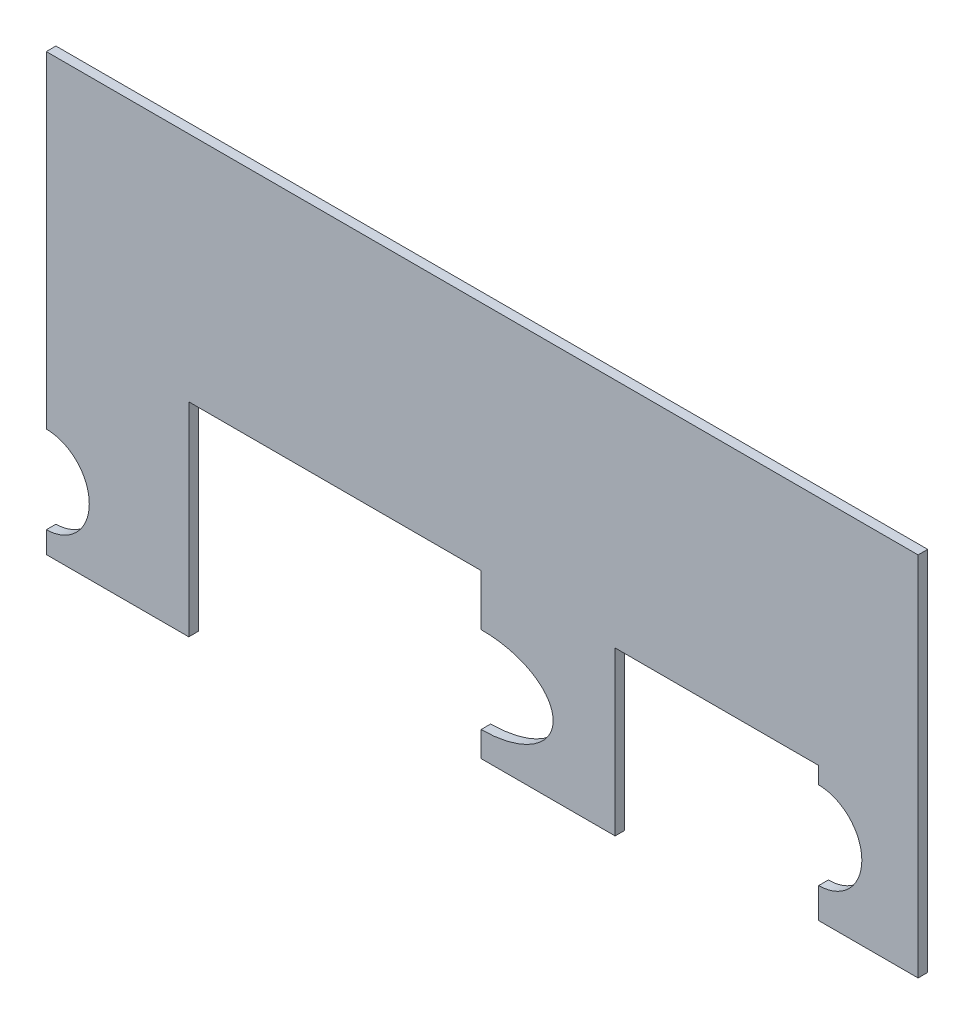
ISO-10303-21;
HEADER;
FILE_DESCRIPTION(('STEP AP214'),'2;1');
FILE_NAME('part.step','',(''),(''),'','','');
FILE_SCHEMA(('AUTOMOTIVE_DESIGN { 1 0 10303 214 1 1 1 1 }'));
ENDSEC;
DATA;
#1=APPLICATION_CONTEXT('core data for automotive mechanical design processes');
#2=APPLICATION_PROTOCOL_DEFINITION('international standard','automotive_design',2000,#1);
#3=PRODUCT_CONTEXT('',#1,'mechanical');
#4=PRODUCT('Part','Part','',(#3));
#5=PRODUCT_RELATED_PRODUCT_CATEGORY('part','',(#4));
#6=PRODUCT_DEFINITION_FORMATION('','',#4);
#7=PRODUCT_DEFINITION_CONTEXT('part definition',#1,'design');
#8=PRODUCT_DEFINITION('design','',#6,#7);
#9=PRODUCT_DEFINITION_SHAPE('','',#8);
#10=(LENGTH_UNIT() NAMED_UNIT(*) SI_UNIT(.MILLI.,.METRE.));
#11=(NAMED_UNIT(*) PLANE_ANGLE_UNIT() SI_UNIT($,.RADIAN.));
#12=(NAMED_UNIT(*) SI_UNIT($,.STERADIAN.) SOLID_ANGLE_UNIT());
#13=UNCERTAINTY_MEASURE_WITH_UNIT(LENGTH_MEASURE(1.E-05),#10,'distance_accuracy_value','');
#14=(GEOMETRIC_REPRESENTATION_CONTEXT(3) GLOBAL_UNCERTAINTY_ASSIGNED_CONTEXT((#13)) GLOBAL_UNIT_ASSIGNED_CONTEXT((#10,
#11,#12)) REPRESENTATION_CONTEXT('',''));
#15=CARTESIAN_POINT('',(0.,0.,0.));
#16=DIRECTION('',(0.,0.,1.));
#17=DIRECTION('',(1.,0.,0.));
#18=AXIS2_PLACEMENT_3D('',#15,#16,#17);
#19=CARTESIAN_POINT('',(0.,0.,3.));
#20=DIRECTION('',(0.,0.,-1.));
#21=DIRECTION('',(-1.,0.,0.));
#22=AXIS2_PLACEMENT_3D('',#19,#20,#21);
#23=PLANE('',#22);
#24=DIRECTION('',(0.,1.,0.));
#25=VECTOR('',#24,1.);
#26=CARTESIAN_POINT('',(-271.955362236481,0.,3.));
#27=LINE('',#26,#25);
#28=CARTESIAN_POINT('',(-271.955362236477,-355.976421691856,3.));
#29=VERTEX_POINT('',#28);
#30=CARTESIAN_POINT('',(-271.955362236481,-254.,3.));
#31=VERTEX_POINT('',#30);
#32=EDGE_CURVE('E188',#29,#31,#27,.T.);
#33=ORIENTED_EDGE('',*,*,#32,.F.);
#34=CARTESIAN_POINT('',(-278.621518651951,-381.538192290105,3.));
#35=CARTESIAN_POINT('',(-278.370340025433,-381.675788485271,3.));
#36=CARTESIAN_POINT('',(-277.859461828968,-381.935426093259,3.));
#37=CARTESIAN_POINT('',(-276.719402462415,-382.422402226099,3.));
#38=CARTESIAN_POINT('',(-274.453837445501,-383.121197535497,3.));
#39=CARTESIAN_POINT('',(-270.353871795164,-383.430649394641,3.));
#40=CARTESIAN_POINT('',(-265.517981505841,-381.766237096782,3.));
#41=CARTESIAN_POINT('',(-262.1227072671,-378.912933368147,3.));
#42=CARTESIAN_POINT('',(-260.11186544475,-376.132298445354,3.));
#43=CARTESIAN_POINT('',(-258.851133292206,-372.940751822178,3.));
#44=CARTESIAN_POINT('',(-258.274482706022,-368.543399957071,3.));
#45=CARTESIAN_POINT('',(-259.475297643461,-363.572067472349,3.));
#46=CARTESIAN_POINT('',(-261.943328374558,-360.283556700368,3.));
#47=CARTESIAN_POINT('',(-263.751900196114,-358.750531033077,3.));
#48=CARTESIAN_POINT('',(-264.776043252502,-358.051952395218,3.));
#49=CARTESIAN_POINT('',(-265.516797716913,-357.615831636206,3.));
#50=CARTESIAN_POINT('',(-266.28311501161,-357.226375224223,3.));
#51=CARTESIAN_POINT('',(-267.423174378163,-356.739399091383,3.));
#52=CARTESIAN_POINT('',(-269.688739395077,-356.040603781985,3.));
#53=CARTESIAN_POINT('',(-273.788705045415,-355.731151922841,3.));
#54=CARTESIAN_POINT('',(-278.624595334737,-357.3955642207,3.));
#55=CARTESIAN_POINT('',(-282.019869573478,-360.248867949335,3.));
#56=CARTESIAN_POINT('',(-284.030711395829,-363.029502872128,3.));
#57=CARTESIAN_POINT('',(-285.291443548372,-366.221049495305,3.));
#58=CARTESIAN_POINT('',(-285.868094134556,-370.618401360411,3.));
#59=CARTESIAN_POINT('',(-284.667279197117,-375.589733845133,3.));
#60=CARTESIAN_POINT('',(-282.19924846602,-378.878244617114,3.));
#61=CARTESIAN_POINT('',(-280.390676644465,-380.411270284406,3.));
#62=CARTESIAN_POINT('',(-279.366533588076,-381.109848922264,3.));
#63=CARTESIAN_POINT('',(-278.872697278469,-381.400596094939,3.));
#64=CARTESIAN_POINT('',(-278.621518651951,-381.538192290105,3.));
#65=B_SPLINE_CURVE_WITH_KNOTS('',3,(#34,#35,#36,#37,#38,#39,#40,#41,#42,#43,#44,#45,#46,#47,#48,
#49,#50,#51,#52,#53,#54,#55,#56,#57,#58,#59,#60,#61,#62,#63,#64),.UNSPECIFIED.,.T.,.F.,(4,1,1,1,
1,1,1,1,1,1,1,1,1,1,1,1,1,1,1,1,1,1,1,1,1,1,1,1,4),(0.,0.015625,0.03125,0.0625,0.125,0.1875,
0.21875,0.25,0.28125,0.3125,0.375,0.4375,0.46875,0.484375,0.5,0.515625,0.53125,0.5625,0.625,
0.6875,0.71875,0.75,0.78125,0.8125,0.875,0.9375,0.96875,0.984375,1.),.UNSPECIFIED.);
#66=CARTESIAN_POINT('',(-271.955362243084,-383.183342538427,3.));
#67=VERTEX_POINT('',#66);
#68=EDGE_CURVE('E193',#67,#29,#65,.T.);
#69=ORIENTED_EDGE('',*,*,#68,.F.);
#70=CARTESIAN_POINT('',(-271.955362236481,-389.89,3.));
#71=VERTEX_POINT('',#70);
#72=EDGE_CURVE('E179',#71,#67,#27,.T.);
#73=ORIENTED_EDGE('',*,*,#72,.F.);
#74=DIRECTION('',(-1.,0.,0.));
#75=VECTOR('',#74,1.);
#76=CARTESIAN_POINT('',(0.,-389.89,3.));
#77=LINE('',#76,#75);
#78=CARTESIAN_POINT('',(-227.505362236481,-389.89,3.));
#79=VERTEX_POINT('',#78);
#80=EDGE_CURVE('E167',#79,#71,#77,.T.);
#81=ORIENTED_EDGE('',*,*,#80,.F.);
#82=DIRECTION('',(0.,-1.,0.));
#83=VECTOR('',#82,1.);
#84=CARTESIAN_POINT('',(-227.505362236481,0.,3.));
#85=LINE('',#84,#83);
#86=CARTESIAN_POINT('',(-227.505362236481,-326.39,3.));
#87=VERTEX_POINT('',#86);
#88=EDGE_CURVE('E178',#87,#79,#85,.T.);
#89=ORIENTED_EDGE('',*,*,#88,.F.);
#90=DIRECTION('',(-1.,0.,0.));
#91=VECTOR('',#90,1.);
#92=CARTESIAN_POINT('',(0.,-326.39,3.));
#93=LINE('',#92,#91);
#94=CARTESIAN_POINT('',(-136.330752090625,-326.39,3.));
#95=VERTEX_POINT('',#94);
#96=EDGE_CURVE('E394',#95,#87,#93,.T.);
#97=ORIENTED_EDGE('',*,*,#96,.F.);
#98=DIRECTION('',(0.,1.,0.));
#99=VECTOR('',#98,1.);
#100=CARTESIAN_POINT('',(-136.330752090625,0.,3.));
#101=LINE('',#100,#99);
#102=CARTESIAN_POINT('',(-136.330752071237,-342.354877874696,3.));
#103=VERTEX_POINT('',#102);
#104=EDGE_CURVE('E397',#103,#95,#101,.T.);
#105=ORIENTED_EDGE('',*,*,#104,.F.);
#106=CARTESIAN_POINT('',(-158.330065966523,-356.075599307462,3.));
#107=CARTESIAN_POINT('',(-158.327001416,-356.373395785938,3.));
#108=CARTESIAN_POINT('',(-158.290080956929,-356.968671876576,3.));
#109=CARTESIAN_POINT('',(-158.067598917984,-358.24660886727,3.));
#110=CARTESIAN_POINT('',(-157.224453748445,-360.632921919859,3.));
#111=CARTESIAN_POINT('',(-154.882508757872,-363.615638807092,3.));
#112=CARTESIAN_POINT('',(-150.614101821919,-366.327010398472,3.));
#113=CARTESIAN_POINT('',(-146.438166973224,-368.010630748896,3.));
#114=CARTESIAN_POINT('',(-141.43480585188,-369.121724295185,3.));
#115=CARTESIAN_POINT('',(-135.953318407634,-369.477027412417,3.));
#116=CARTESIAN_POINT('',(-130.480303715626,-369.008994200355,3.));
#117=CARTESIAN_POINT('',(-125.500867751197,-367.795170137595,3.));
#118=CARTESIAN_POINT('',(-121.360465047816,-366.025968397051,3.));
#119=CARTESIAN_POINT('',(-117.148760272717,-363.227330055849,3.));
#120=CARTESIAN_POINT('',(-114.868693567404,-360.197049179828,3.));
#121=CARTESIAN_POINT('',(-114.074835680623,-357.793890130272,3.));
#122=CARTESIAN_POINT('',(-113.878699845457,-356.511645245703,3.));
#123=CARTESIAN_POINT('',(-113.841706459993,-355.617780510805,3.));
#124=CARTESIAN_POINT('',(-113.897087148599,-354.724866374849,3.));
#125=CARTESIAN_POINT('',(-114.119569187544,-353.446929384154,3.));
#126=CARTESIAN_POINT('',(-114.962714357083,-351.060616331566,3.));
#127=CARTESIAN_POINT('',(-117.304659347656,-348.077899444333,3.));
#128=CARTESIAN_POINT('',(-121.57306628361,-345.366527852953,3.));
#129=CARTESIAN_POINT('',(-125.749001132304,-343.682907502528,3.));
#130=CARTESIAN_POINT('',(-130.752362253648,-342.57181395624,3.));
#131=CARTESIAN_POINT('',(-136.233849697894,-342.216510839008,3.));
#132=CARTESIAN_POINT('',(-141.706864389903,-342.68454405107,3.));
#133=CARTESIAN_POINT('',(-146.686300354332,-343.89836811383,3.));
#134=CARTESIAN_POINT('',(-150.826703057712,-345.667569854374,3.));
#135=CARTESIAN_POINT('',(-155.038407832811,-348.466208195576,3.));
#136=CARTESIAN_POINT('',(-157.318474538124,-351.496489071597,3.));
#137=CARTESIAN_POINT('',(-158.112332424906,-353.899648121153,3.));
#138=CARTESIAN_POINT('',(-158.308468260072,-355.181893005722,3.));
#139=CARTESIAN_POINT('',(-158.333130517047,-355.777802828987,3.));
#140=CARTESIAN_POINT('',(-158.330065966523,-356.075599307462,3.));
#141=B_SPLINE_CURVE_WITH_KNOTS('',3,(#106,#107,#108,#109,#110,#111,#112,#113,#114,#115,#116,
#117,#118,#119,#120,#121,#122,#123,#124,#125,#126,#127,#128,#129,#130,#131,#132,#133,#134,#135,
#136,#137,#138,#139,#140),.UNSPECIFIED.,.T.,.F.,(4,1,1,1,1,1,1,1,1,1,1,1,1,1,1,1,1,1,1,1,1,1,1,
1,1,1,1,1,1,1,1,1,4),(0.,0.015625,0.03125,0.0625,0.125,0.15625,0.1875,0.21875,0.25,0.28125,
0.3125,0.34375,0.375,0.4375,0.46875,0.484375,0.5,0.515625,0.53125,0.5625,0.625,0.65625,0.6875,
0.71875,0.75,0.78125,0.8125,0.84375,0.875,0.9375,0.96875,0.984375,1.),.UNSPECIFIED.);
#142=CARTESIAN_POINT('',(-136.330752071393,-369.341737674634,3.));
#143=VERTEX_POINT('',#142);
#144=EDGE_CURVE('E330',#143,#103,#141,.T.);
#145=ORIENTED_EDGE('',*,*,#144,.F.);
#146=CARTESIAN_POINT('',(-136.330752090625,-377.19,3.));
#147=VERTEX_POINT('',#146);
#148=EDGE_CURVE('E63',#147,#143,#101,.T.);
#149=ORIENTED_EDGE('',*,*,#148,.F.);
#150=DIRECTION('',(-1.,0.,0.));
#151=VECTOR('',#150,1.);
#152=CARTESIAN_POINT('',(0.,-377.19,3.));
#153=LINE('',#152,#151);
#154=CARTESIAN_POINT('',(-94.5125920507911,-377.19,3.));
#155=VERTEX_POINT('',#154);
#156=EDGE_CURVE('E402',#155,#147,#153,.T.);
#157=ORIENTED_EDGE('',*,*,#156,.F.);
#158=DIRECTION('',(0.,-1.,0.));
#159=VECTOR('',#158,1.);
#160=CARTESIAN_POINT('',(-94.512592050791,0.,3.));
#161=LINE('',#160,#159);
#162=CARTESIAN_POINT('',(-94.5125920507911,-326.39,3.));
#163=VERTEX_POINT('',#162);
#164=EDGE_CURVE('E405',#163,#155,#161,.T.);
#165=ORIENTED_EDGE('',*,*,#164,.F.);
#166=DIRECTION('',(-1.,0.,0.));
#167=VECTOR('',#166,1.);
#168=CARTESIAN_POINT('',(0.,-326.39,3.));
#169=LINE('',#168,#167);
#170=CARTESIAN_POINT('',(-31.0125920507911,-326.39,3.));
#171=VERTEX_POINT('',#170);
#172=EDGE_CURVE('E407',#171,#163,#169,.T.);
#173=ORIENTED_EDGE('',*,*,#172,.F.);
#174=DIRECTION('',(0.,1.,0.));
#175=VECTOR('',#174,1.);
#176=CARTESIAN_POINT('',(-31.0125920507911,0.,3.));
#177=LINE('',#176,#175);
#178=CARTESIAN_POINT('',(-31.0125920507874,-331.651825693571,3.));
#179=VERTEX_POINT('',#178);
#180=EDGE_CURVE('E210',#179,#171,#177,.T.);
#181=ORIENTED_EDGE('',*,*,#180,.F.);
#182=CARTESIAN_POINT('',(-33.9641655474843,-331.962198831726,3.));
#183=CARTESIAN_POINT('',(-34.2438680765539,-332.023492326205,3.));
#184=CARTESIAN_POINT('',(-34.7994902438659,-332.163341899727,3.));
#185=CARTESIAN_POINT('',(-35.978750804576,-332.544818645064,3.));
#186=CARTESIAN_POINT('',(-38.1457535776064,-333.504844288757,3.));
#187=CARTESIAN_POINT('',(-41.4407723492287,-335.959441017826,3.));
#188=CARTESIAN_POINT('',(-43.9959626879415,-340.379536121152,3.));
#189=CARTESIAN_POINT('',(-44.6840393480456,-344.749082337409,3.));
#190=CARTESIAN_POINT('',(-44.3752989422524,-348.156558860998,3.));
#191=CARTESIAN_POINT('',(-43.2307594991895,-351.380879930658,3.));
#192=CARTESIAN_POINT('',(-40.7784217971011,-355.062241556619,3.));
#193=CARTESIAN_POINT('',(-36.6089376847144,-358.008703948379,3.));
#194=CARTESIAN_POINT('',(-32.5893842807403,-358.860398870459,3.));
#195=CARTESIAN_POINT('',(-30.2194935811096,-358.826218076529,3.));
#196=CARTESIAN_POINT('',(-28.9887718381782,-358.679575760822,3.));
#197=CARTESIAN_POINT('',(-28.1439899147287,-358.521589154227,3.));
#198=CARTESIAN_POINT('',(-27.3105566637607,-358.311814793945,3.));
#199=CARTESIAN_POINT('',(-26.1312961030506,-357.930338048607,3.));
#200=CARTESIAN_POINT('',(-23.9642933300201,-356.970312404914,3.));
#201=CARTESIAN_POINT('',(-20.6692745583979,-354.515715675846,3.));
#202=CARTESIAN_POINT('',(-18.1140842196851,-350.09562057252,3.));
#203=CARTESIAN_POINT('',(-17.426007559581,-345.726074356263,3.));
#204=CARTESIAN_POINT('',(-17.7347479653742,-342.318597832674,3.));
#205=CARTESIAN_POINT('',(-18.8792874084371,-339.094276763014,3.));
#206=CARTESIAN_POINT('',(-21.3316251105255,-335.412915137052,3.));
#207=CARTESIAN_POINT('',(-25.5011092229122,-332.466452745293,3.));
#208=CARTESIAN_POINT('',(-29.5206626268863,-331.614757823212,3.));
#209=CARTESIAN_POINT('',(-31.890553326517,-331.648938617143,3.));
#210=CARTESIAN_POINT('',(-33.1212750694484,-331.79558093285,3.));
#211=CARTESIAN_POINT('',(-33.6844630184148,-331.900905337246,3.));
#212=CARTESIAN_POINT('',(-33.9641655474843,-331.962198831726,3.));
#213=B_SPLINE_CURVE_WITH_KNOTS('',3,(#182,#183,#184,#185,#186,#187,#188,#189,#190,#191,#192,
#193,#194,#195,#196,#197,#198,#199,#200,#201,#202,#203,#204,#205,#206,#207,#208,#209,#210,#211,
#212),.UNSPECIFIED.,.T.,.F.,(4,1,1,1,1,1,1,1,1,1,1,1,1,1,1,1,1,1,1,1,1,1,1,1,1,1,1,1,4),(0.,
0.015625,0.03125,0.0625,0.125,0.1875,0.21875,0.25,0.28125,0.3125,0.375,0.4375,0.46875,0.484375,
0.5,0.515625,0.53125,0.5625,0.625,0.6875,0.71875,0.75,0.78125,0.8125,0.875,0.9375,0.96875,
0.984375,1.),.UNSPECIFIED.);
#214=CARTESIAN_POINT('',(-31.0125920386938,-358.823600104807,3.));
#215=VERTEX_POINT('',#214);
#216=EDGE_CURVE('E345',#215,#179,#213,.T.);
#217=ORIENTED_EDGE('',*,*,#216,.F.);
#218=CARTESIAN_POINT('',(-31.0125920507911,-368.3,3.));
#219=VERTEX_POINT('',#218);
#220=EDGE_CURVE('E55',#219,#215,#177,.T.);
#221=ORIENTED_EDGE('',*,*,#220,.F.);
#222=DIRECTION('',(-1.,0.,0.));
#223=VECTOR('',#222,1.);
#224=CARTESIAN_POINT('',(0.,-368.3,3.));
#225=LINE('',#224,#223);
#226=CARTESIAN_POINT('',(0.,-368.3,3.));
#227=VERTEX_POINT('',#226);
#228=EDGE_CURVE('E202',#227,#219,#225,.T.);
#229=ORIENTED_EDGE('',*,*,#228,.F.);
#230=DIRECTION('',(0.,1.,0.));
#231=VECTOR('',#230,1.);
#232=CARTESIAN_POINT('',(3.88578058618805E-13,-254.,3.));
#233=LINE('',#232,#231);
#234=CARTESIAN_POINT('',(3.88578058618805E-13,-254.,3.));
#235=VERTEX_POINT('',#234);
#236=EDGE_CURVE('E364',#227,#235,#233,.T.);
#237=ORIENTED_EDGE('',*,*,#236,.T.);
#238=DIRECTION('',(-1.,0.,0.));
#239=VECTOR('',#238,1.);
#240=CARTESIAN_POINT('',(-330.2,-254.,3.));
#241=LINE('',#240,#239);
#242=EDGE_CURVE('E48',#235,#31,#241,.T.);
#243=ORIENTED_EDGE('',*,*,#242,.T.);
#244=EDGE_LOOP('',(#33,#69,#73,#81,#89,#97,#105,#145,#149,#157,#165,#173,#181,#217,#221,#229,
#237,#243));
#245=FACE_BOUND('',#244,.T.);
#246=ADVANCED_FACE('F39',(#245),#23,.F.);
#247=CARTESIAN_POINT('',(0.,0.,0.));
#248=DIRECTION('',(0.,0.,-1.));
#249=DIRECTION('',(-1.,0.,0.));
#250=AXIS2_PLACEMENT_3D('',#247,#248,#249);
#251=PLANE('',#250);
#252=CARTESIAN_POINT('',(-278.621518651951,-381.538192290105,0.));
#253=CARTESIAN_POINT('',(-278.370340025433,-381.675788485271,0.));
#254=CARTESIAN_POINT('',(-277.859461828968,-381.935426093259,0.));
#255=CARTESIAN_POINT('',(-276.719402462415,-382.422402226099,0.));
#256=CARTESIAN_POINT('',(-274.453837445501,-383.121197535497,0.));
#257=CARTESIAN_POINT('',(-270.353871795164,-383.430649394641,0.));
#258=CARTESIAN_POINT('',(-265.517981505841,-381.766237096782,0.));
#259=CARTESIAN_POINT('',(-262.1227072671,-378.912933368147,0.));
#260=CARTESIAN_POINT('',(-260.11186544475,-376.132298445354,0.));
#261=CARTESIAN_POINT('',(-258.851133292206,-372.940751822178,0.));
#262=CARTESIAN_POINT('',(-258.274482706022,-368.543399957071,0.));
#263=CARTESIAN_POINT('',(-259.475297643461,-363.572067472349,0.));
#264=CARTESIAN_POINT('',(-261.943328374558,-360.283556700368,0.));
#265=CARTESIAN_POINT('',(-263.751900196114,-358.750531033077,0.));
#266=CARTESIAN_POINT('',(-264.776043252502,-358.051952395218,0.));
#267=CARTESIAN_POINT('',(-265.516797716913,-357.615831636206,0.));
#268=CARTESIAN_POINT('',(-266.28311501161,-357.226375224223,0.));
#269=CARTESIAN_POINT('',(-267.423174378163,-356.739399091383,0.));
#270=CARTESIAN_POINT('',(-269.688739395077,-356.040603781985,0.));
#271=CARTESIAN_POINT('',(-273.788705045415,-355.731151922841,0.));
#272=CARTESIAN_POINT('',(-278.624595334737,-357.3955642207,0.));
#273=CARTESIAN_POINT('',(-282.019869573478,-360.248867949335,0.));
#274=CARTESIAN_POINT('',(-284.030711395829,-363.029502872128,0.));
#275=CARTESIAN_POINT('',(-285.291443548372,-366.221049495305,0.));
#276=CARTESIAN_POINT('',(-285.868094134556,-370.618401360411,0.));
#277=CARTESIAN_POINT('',(-284.667279197117,-375.589733845133,0.));
#278=CARTESIAN_POINT('',(-282.19924846602,-378.878244617114,0.));
#279=CARTESIAN_POINT('',(-280.390676644465,-380.411270284406,0.));
#280=CARTESIAN_POINT('',(-279.366533588076,-381.109848922264,0.));
#281=CARTESIAN_POINT('',(-278.872697278469,-381.400596094939,0.));
#282=CARTESIAN_POINT('',(-278.621518651951,-381.538192290105,0.));
#283=B_SPLINE_CURVE_WITH_KNOTS('',3,(#252,#253,#254,#255,#256,#257,#258,#259,#260,#261,#262,
#263,#264,#265,#266,#267,#268,#269,#270,#271,#272,#273,#274,#275,#276,#277,#278,#279,#280,#281,
#282),.UNSPECIFIED.,.T.,.F.,(4,1,1,1,1,1,1,1,1,1,1,1,1,1,1,1,1,1,1,1,1,1,1,1,1,1,1,1,4),(0.,
0.015625,0.03125,0.0625,0.125,0.1875,0.21875,0.25,0.28125,0.3125,0.375,0.4375,0.46875,0.484375,
0.5,0.515625,0.53125,0.5625,0.625,0.6875,0.71875,0.75,0.78125,0.8125,0.875,0.9375,0.96875,
0.984375,1.),.UNSPECIFIED.);
#284=CARTESIAN_POINT('',(-271.955362243084,-383.183342538427,0.));
#285=VERTEX_POINT('',#284);
#286=CARTESIAN_POINT('',(-271.955362236477,-355.976421691856,0.));
#287=VERTEX_POINT('',#286);
#288=EDGE_CURVE('E254',#285,#287,#283,.T.);
#289=ORIENTED_EDGE('',*,*,#288,.T.);
#290=DIRECTION('',(0.,1.,0.));
#291=VECTOR('',#290,1.);
#292=CARTESIAN_POINT('',(-271.955362236481,0.,0.));
#293=LINE('',#292,#291);
#294=CARTESIAN_POINT('',(-271.955362236481,-254.,0.));
#295=VERTEX_POINT('',#294);
#296=EDGE_CURVE('E195',#287,#295,#293,.T.);
#297=ORIENTED_EDGE('',*,*,#296,.T.);
#298=DIRECTION('',(-1.,0.,0.));
#299=VECTOR('',#298,1.);
#300=CARTESIAN_POINT('',(-330.2,-254.,0.));
#301=LINE('',#300,#299);
#302=CARTESIAN_POINT('',(3.88578058618805E-13,-254.,0.));
#303=VERTEX_POINT('',#302);
#304=EDGE_CURVE('E370',#303,#295,#301,.T.);
#305=ORIENTED_EDGE('',*,*,#304,.F.);
#306=DIRECTION('',(0.,1.,0.));
#307=VECTOR('',#306,1.);
#308=CARTESIAN_POINT('',(3.88578058618805E-13,-254.,0.));
#309=LINE('',#308,#307);
#310=CARTESIAN_POINT('',(0.,-368.3,0.));
#311=VERTEX_POINT('',#310);
#312=EDGE_CURVE('E355',#311,#303,#309,.T.);
#313=ORIENTED_EDGE('',*,*,#312,.F.);
#314=DIRECTION('',(-1.,0.,0.));
#315=VECTOR('',#314,1.);
#316=CARTESIAN_POINT('',(0.,-368.3,0.));
#317=LINE('',#316,#315);
#318=CARTESIAN_POINT('',(-31.0125920507911,-368.3,0.));
#319=VERTEX_POINT('',#318);
#320=EDGE_CURVE('E199',#311,#319,#317,.T.);
#321=ORIENTED_EDGE('',*,*,#320,.T.);
#322=DIRECTION('',(0.,1.,0.));
#323=VECTOR('',#322,1.);
#324=CARTESIAN_POINT('',(-31.0125920507911,0.,0.));
#325=LINE('',#324,#323);
#326=CARTESIAN_POINT('',(-31.0125920386938,-358.823600104807,0.));
#327=VERTEX_POINT('',#326);
#328=EDGE_CURVE('E247',#319,#327,#325,.T.);
#329=ORIENTED_EDGE('',*,*,#328,.T.);
#330=CARTESIAN_POINT('',(-33.9641655474843,-331.962198831726,0.));
#331=CARTESIAN_POINT('',(-34.2438680765539,-332.023492326205,0.));
#332=CARTESIAN_POINT('',(-34.7994902438659,-332.163341899727,0.));
#333=CARTESIAN_POINT('',(-35.978750804576,-332.544818645064,0.));
#334=CARTESIAN_POINT('',(-38.1457535776064,-333.504844288757,0.));
#335=CARTESIAN_POINT('',(-41.4407723492287,-335.959441017826,0.));
#336=CARTESIAN_POINT('',(-43.9959626879415,-340.379536121152,0.));
#337=CARTESIAN_POINT('',(-44.6840393480456,-344.749082337409,0.));
#338=CARTESIAN_POINT('',(-44.3752989422524,-348.156558860998,0.));
#339=CARTESIAN_POINT('',(-43.2307594991895,-351.380879930658,0.));
#340=CARTESIAN_POINT('',(-40.7784217971011,-355.062241556619,0.));
#341=CARTESIAN_POINT('',(-36.6089376847144,-358.008703948379,0.));
#342=CARTESIAN_POINT('',(-32.5893842807403,-358.860398870459,0.));
#343=CARTESIAN_POINT('',(-30.2194935811096,-358.826218076529,0.));
#344=CARTESIAN_POINT('',(-28.9887718381782,-358.679575760822,0.));
#345=CARTESIAN_POINT('',(-28.1439899147287,-358.521589154227,0.));
#346=CARTESIAN_POINT('',(-27.3105566637607,-358.311814793945,0.));
#347=CARTESIAN_POINT('',(-26.1312961030506,-357.930338048607,0.));
#348=CARTESIAN_POINT('',(-23.9642933300201,-356.970312404914,0.));
#349=CARTESIAN_POINT('',(-20.6692745583979,-354.515715675846,0.));
#350=CARTESIAN_POINT('',(-18.1140842196851,-350.09562057252,0.));
#351=CARTESIAN_POINT('',(-17.426007559581,-345.726074356263,0.));
#352=CARTESIAN_POINT('',(-17.7347479653742,-342.318597832674,0.));
#353=CARTESIAN_POINT('',(-18.8792874084371,-339.094276763014,0.));
#354=CARTESIAN_POINT('',(-21.3316251105255,-335.412915137052,0.));
#355=CARTESIAN_POINT('',(-25.5011092229122,-332.466452745293,0.));
#356=CARTESIAN_POINT('',(-29.5206626268863,-331.614757823212,0.));
#357=CARTESIAN_POINT('',(-31.890553326517,-331.648938617143,0.));
#358=CARTESIAN_POINT('',(-33.1212750694484,-331.79558093285,0.));
#359=CARTESIAN_POINT('',(-33.6844630184148,-331.900905337246,0.));
#360=CARTESIAN_POINT('',(-33.9641655474843,-331.962198831726,0.));
#361=B_SPLINE_CURVE_WITH_KNOTS('',3,(#330,#331,#332,#333,#334,#335,#336,#337,#338,#339,#340,
#341,#342,#343,#344,#345,#346,#347,#348,#349,#350,#351,#352,#353,#354,#355,#356,#357,#358,#359,
#360),.UNSPECIFIED.,.T.,.F.,(4,1,1,1,1,1,1,1,1,1,1,1,1,1,1,1,1,1,1,1,1,1,1,1,1,1,1,1,4),(0.,
0.015625,0.03125,0.0625,0.125,0.1875,0.21875,0.25,0.28125,0.3125,0.375,0.4375,0.46875,0.484375,
0.5,0.515625,0.53125,0.5625,0.625,0.6875,0.71875,0.75,0.78125,0.8125,0.875,0.9375,0.96875,
0.984375,1.),.UNSPECIFIED.);
#362=CARTESIAN_POINT('',(-31.0125920507874,-331.651825693571,0.));
#363=VERTEX_POINT('',#362);
#364=EDGE_CURVE('E337',#327,#363,#361,.T.);
#365=ORIENTED_EDGE('',*,*,#364,.T.);
#366=CARTESIAN_POINT('',(-31.0125920507911,-326.39,0.));
#367=VERTEX_POINT('',#366);
#368=EDGE_CURVE('E243',#363,#367,#325,.T.);
#369=ORIENTED_EDGE('',*,*,#368,.T.);
#370=DIRECTION('',(-1.,0.,0.));
#371=VECTOR('',#370,1.);
#372=CARTESIAN_POINT('',(0.,-326.39,0.));
#373=LINE('',#372,#371);
#374=CARTESIAN_POINT('',(-94.5125920507911,-326.39,0.));
#375=VERTEX_POINT('',#374);
#376=EDGE_CURVE('E239',#367,#375,#373,.T.);
#377=ORIENTED_EDGE('',*,*,#376,.T.);
#378=DIRECTION('',(0.,-1.,0.));
#379=VECTOR('',#378,1.);
#380=CARTESIAN_POINT('',(-94.512592050791,0.,0.));
#381=LINE('',#380,#379);
#382=CARTESIAN_POINT('',(-94.5125920507911,-377.19,0.));
#383=VERTEX_POINT('',#382);
#384=EDGE_CURVE('E235',#375,#383,#381,.T.);
#385=ORIENTED_EDGE('',*,*,#384,.T.);
#386=DIRECTION('',(-1.,0.,0.));
#387=VECTOR('',#386,1.);
#388=CARTESIAN_POINT('',(0.,-377.19,0.));
#389=LINE('',#388,#387);
#390=CARTESIAN_POINT('',(-136.330752090625,-377.19,0.));
#391=VERTEX_POINT('',#390);
#392=EDGE_CURVE('E231',#383,#391,#389,.T.);
#393=ORIENTED_EDGE('',*,*,#392,.T.);
#394=DIRECTION('',(0.,1.,0.));
#395=VECTOR('',#394,1.);
#396=CARTESIAN_POINT('',(-136.330752090625,0.,0.));
#397=LINE('',#396,#395);
#398=CARTESIAN_POINT('',(-136.330752071393,-369.341737674634,0.));
#399=VERTEX_POINT('',#398);
#400=EDGE_CURVE('E230',#391,#399,#397,.T.);
#401=ORIENTED_EDGE('',*,*,#400,.T.);
#402=CARTESIAN_POINT('',(-158.330065966523,-356.075599307462,0.));
#403=CARTESIAN_POINT('',(-158.327001416,-356.373395785938,0.));
#404=CARTESIAN_POINT('',(-158.290080956929,-356.968671876576,0.));
#405=CARTESIAN_POINT('',(-158.067598917984,-358.24660886727,0.));
#406=CARTESIAN_POINT('',(-157.224453748445,-360.632921919859,0.));
#407=CARTESIAN_POINT('',(-154.882508757872,-363.615638807092,0.));
#408=CARTESIAN_POINT('',(-150.614101821919,-366.327010398472,0.));
#409=CARTESIAN_POINT('',(-146.438166973224,-368.010630748896,0.));
#410=CARTESIAN_POINT('',(-141.43480585188,-369.121724295185,0.));
#411=CARTESIAN_POINT('',(-135.953318407634,-369.477027412417,0.));
#412=CARTESIAN_POINT('',(-130.480303715626,-369.008994200355,0.));
#413=CARTESIAN_POINT('',(-125.500867751197,-367.795170137595,0.));
#414=CARTESIAN_POINT('',(-121.360465047816,-366.025968397051,0.));
#415=CARTESIAN_POINT('',(-117.148760272717,-363.227330055849,0.));
#416=CARTESIAN_POINT('',(-114.868693567404,-360.197049179828,0.));
#417=CARTESIAN_POINT('',(-114.074835680623,-357.793890130272,0.));
#418=CARTESIAN_POINT('',(-113.878699845457,-356.511645245703,0.));
#419=CARTESIAN_POINT('',(-113.841706459993,-355.617780510805,0.));
#420=CARTESIAN_POINT('',(-113.897087148599,-354.724866374849,0.));
#421=CARTESIAN_POINT('',(-114.119569187544,-353.446929384154,0.));
#422=CARTESIAN_POINT('',(-114.962714357083,-351.060616331566,0.));
#423=CARTESIAN_POINT('',(-117.304659347656,-348.077899444333,0.));
#424=CARTESIAN_POINT('',(-121.57306628361,-345.366527852953,0.));
#425=CARTESIAN_POINT('',(-125.749001132304,-343.682907502528,0.));
#426=CARTESIAN_POINT('',(-130.752362253648,-342.57181395624,0.));
#427=CARTESIAN_POINT('',(-136.233849697894,-342.216510839008,0.));
#428=CARTESIAN_POINT('',(-141.706864389903,-342.68454405107,0.));
#429=CARTESIAN_POINT('',(-146.686300354332,-343.89836811383,0.));
#430=CARTESIAN_POINT('',(-150.826703057712,-345.667569854374,0.));
#431=CARTESIAN_POINT('',(-155.038407832811,-348.466208195576,0.));
#432=CARTESIAN_POINT('',(-157.318474538124,-351.496489071597,0.));
#433=CARTESIAN_POINT('',(-158.112332424906,-353.899648121153,0.));
#434=CARTESIAN_POINT('',(-158.308468260072,-355.181893005722,0.));
#435=CARTESIAN_POINT('',(-158.333130517047,-355.777802828987,0.));
#436=CARTESIAN_POINT('',(-158.330065966523,-356.075599307462,0.));
#437=B_SPLINE_CURVE_WITH_KNOTS('',3,(#402,#403,#404,#405,#406,#407,#408,#409,#410,#411,#412,
#413,#414,#415,#416,#417,#418,#419,#420,#421,#422,#423,#424,#425,#426,#427,#428,#429,#430,#431,
#432,#433,#434,#435,#436),.UNSPECIFIED.,.T.,.F.,(4,1,1,1,1,1,1,1,1,1,1,1,1,1,1,1,1,1,1,1,1,1,1,
1,1,1,1,1,1,1,1,1,4),(0.,0.015625,0.03125,0.0625,0.125,0.15625,0.1875,0.21875,0.25,0.28125,
0.3125,0.34375,0.375,0.4375,0.46875,0.484375,0.5,0.515625,0.53125,0.5625,0.625,0.65625,0.6875,
0.71875,0.75,0.78125,0.8125,0.84375,0.875,0.9375,0.96875,0.984375,1.),.UNSPECIFIED.);
#438=CARTESIAN_POINT('',(-136.330752071237,-342.354877874696,0.));
#439=VERTEX_POINT('',#438);
#440=EDGE_CURVE('E308',#399,#439,#437,.T.);
#441=ORIENTED_EDGE('',*,*,#440,.T.);
#442=CARTESIAN_POINT('',(-136.330752090625,-326.39,0.));
#443=VERTEX_POINT('',#442);
#444=EDGE_CURVE('E226',#439,#443,#397,.T.);
#445=ORIENTED_EDGE('',*,*,#444,.T.);
#446=DIRECTION('',(-1.,0.,0.));
#447=VECTOR('',#446,1.);
#448=CARTESIAN_POINT('',(0.,-326.39,0.));
#449=LINE('',#448,#447);
#450=CARTESIAN_POINT('',(-227.505362236481,-326.39,0.));
#451=VERTEX_POINT('',#450);
#452=EDGE_CURVE('E222',#443,#451,#449,.T.);
#453=ORIENTED_EDGE('',*,*,#452,.T.);
#454=DIRECTION('',(0.,-1.,0.));
#455=VECTOR('',#454,1.);
#456=CARTESIAN_POINT('',(-227.505362236481,0.,0.));
#457=LINE('',#456,#455);
#458=CARTESIAN_POINT('',(-227.505362236481,-389.89,0.));
#459=VERTEX_POINT('',#458);
#460=EDGE_CURVE('E218',#451,#459,#457,.T.);
#461=ORIENTED_EDGE('',*,*,#460,.T.);
#462=DIRECTION('',(-1.,0.,0.));
#463=VECTOR('',#462,1.);
#464=CARTESIAN_POINT('',(0.,-389.89,0.));
#465=LINE('',#464,#463);
#466=CARTESIAN_POINT('',(-271.955362236481,-389.89,0.));
#467=VERTEX_POINT('',#466);
#468=EDGE_CURVE('E215',#459,#467,#465,.T.);
#469=ORIENTED_EDGE('',*,*,#468,.T.);
#470=EDGE_CURVE('E185',#467,#285,#293,.T.);
#471=ORIENTED_EDGE('',*,*,#470,.T.);
#472=EDGE_LOOP('',(#289,#297,#305,#313,#321,#329,#365,#369,#377,#385,#393,#401,#441,#445,#453,
#461,#469,#471));
#473=FACE_BOUND('',#472,.T.);
#474=ADVANCED_FACE('F385',(#473),#251,.T.);
#475=CARTESIAN_POINT('',(3.88578058618805E-13,-254.,3.));
#476=DIRECTION('',(-1.,0.,0.));
#477=DIRECTION('',(0.,-1.,0.));
#478=AXIS2_PLACEMENT_3D('',#475,#476,#477);
#479=PLANE('',#478);
#480=DIRECTION('',(0.,0.,-1.));
#481=VECTOR('',#480,1.);
#482=CARTESIAN_POINT('',(0.,-368.3,3.));
#483=LINE('',#482,#481);
#484=EDGE_CURVE('E262',#227,#311,#483,.T.);
#485=ORIENTED_EDGE('',*,*,#484,.T.);
#486=ORIENTED_EDGE('',*,*,#312,.T.);
#487=DIRECTION('',(0.,0.,-1.));
#488=VECTOR('',#487,1.);
#489=CARTESIAN_POINT('',(3.88578058618805E-13,-254.,3.));
#490=LINE('',#489,#488);
#491=EDGE_CURVE('E11',#235,#303,#490,.T.);
#492=ORIENTED_EDGE('',*,*,#491,.F.);
#493=ORIENTED_EDGE('',*,*,#236,.F.);
#494=EDGE_LOOP('',(#485,#486,#492,#493));
#495=FACE_BOUND('',#494,.T.);
#496=ADVANCED_FACE('F41',(#495),#479,.F.);
#497=CARTESIAN_POINT('',(-330.2,-254.,3.));
#498=DIRECTION('',(0.,-1.,0.));
#499=DIRECTION('',(0.,0.,-1.));
#500=AXIS2_PLACEMENT_3D('',#497,#498,#499);
#501=PLANE('',#500);
#502=DIRECTION('',(0.,0.,-1.));
#503=VECTOR('',#502,1.);
#504=CARTESIAN_POINT('',(-271.955362236481,-254.,3.));
#505=LINE('',#504,#503);
#506=EDGE_CURVE('E259',#31,#295,#505,.T.);
#507=ORIENTED_EDGE('',*,*,#506,.F.);
#508=ORIENTED_EDGE('',*,*,#242,.F.);
#509=ORIENTED_EDGE('',*,*,#491,.T.);
#510=ORIENTED_EDGE('',*,*,#304,.T.);
#511=EDGE_LOOP('',(#507,#508,#509,#510));
#512=FACE_BOUND('',#511,.T.);
#513=ADVANCED_FACE('F379',(#512),#501,.F.);
#514=DIRECTION('',(0.,0.,-1.));
#515=VECTOR('',#514,1.);
#516=SURFACE_OF_LINEAR_EXTRUSION('',#213,#515);
#517=ORIENTED_EDGE('',*,*,#364,.F.);
#518=DIRECTION('',(0.,0.,-1.));
#519=VECTOR('',#518,1.);
#520=CARTESIAN_POINT('',(-31.0125920386938,-358.823600104807,3.));
#521=LINE('',#520,#519);
#522=EDGE_CURVE('E269',#215,#327,#521,.T.);
#523=ORIENTED_EDGE('',*,*,#522,.F.);
#524=ORIENTED_EDGE('',*,*,#216,.T.);
#525=DIRECTION('',(0.,0.,-1.));
#526=VECTOR('',#525,1.);
#527=CARTESIAN_POINT('',(-31.0125920507874,-331.651825693571,3.));
#528=LINE('',#527,#526);
#529=EDGE_CURVE('E272',#179,#363,#528,.T.);
#530=ORIENTED_EDGE('',*,*,#529,.T.);
#531=EDGE_LOOP('',(#517,#523,#524,#530));
#532=FACE_BOUND('',#531,.T.);
#533=ADVANCED_FACE('F326',(#532),#516,.T.);
#534=DIRECTION('',(0.,0.,-1.));
#535=VECTOR('',#534,1.);
#536=SURFACE_OF_LINEAR_EXTRUSION('',#141,#535);
#537=ORIENTED_EDGE('',*,*,#440,.F.);
#538=DIRECTION('',(0.,0.,-1.));
#539=VECTOR('',#538,1.);
#540=CARTESIAN_POINT('',(-136.330752071393,-369.341737674634,3.));
#541=LINE('',#540,#539);
#542=EDGE_CURVE('E288',#143,#399,#541,.T.);
#543=ORIENTED_EDGE('',*,*,#542,.F.);
#544=ORIENTED_EDGE('',*,*,#144,.T.);
#545=DIRECTION('',(0.,0.,-1.));
#546=VECTOR('',#545,1.);
#547=CARTESIAN_POINT('',(-136.330752071237,-342.354877874696,3.));
#548=LINE('',#547,#546);
#549=EDGE_CURVE('E291',#103,#439,#548,.T.);
#550=ORIENTED_EDGE('',*,*,#549,.T.);
#551=EDGE_LOOP('',(#537,#543,#544,#550));
#552=FACE_BOUND('',#551,.T.);
#553=ADVANCED_FACE('F321',(#552),#536,.T.);
#554=DIRECTION('',(0.,0.,-1.));
#555=VECTOR('',#554,1.);
#556=SURFACE_OF_LINEAR_EXTRUSION('',#65,#555);
#557=ORIENTED_EDGE('',*,*,#288,.F.);
#558=DIRECTION('',(0.,0.,-1.));
#559=VECTOR('',#558,1.);
#560=CARTESIAN_POINT('',(-271.955362243084,-383.183342538427,3.));
#561=LINE('',#560,#559);
#562=EDGE_CURVE('E251',#67,#285,#561,.T.);
#563=ORIENTED_EDGE('',*,*,#562,.F.);
#564=ORIENTED_EDGE('',*,*,#68,.T.);
#565=DIRECTION('',(0.,0.,-1.));
#566=VECTOR('',#565,1.);
#567=CARTESIAN_POINT('',(-271.955362236477,-355.976421691856,3.));
#568=LINE('',#567,#566);
#569=EDGE_CURVE('E255',#29,#287,#568,.T.);
#570=ORIENTED_EDGE('',*,*,#569,.T.);
#571=EDGE_LOOP('',(#557,#563,#564,#570));
#572=FACE_BOUND('',#571,.T.);
#573=ADVANCED_FACE('F316',(#572),#556,.T.);
#574=CARTESIAN_POINT('',(-271.955362236481,0.,3.));
#575=DIRECTION('',(-1.,0.,0.));
#576=DIRECTION('',(0.,0.,1.));
#577=AXIS2_PLACEMENT_3D('',#574,#575,#576);
#578=PLANE('',#577);
#579=ORIENTED_EDGE('',*,*,#296,.F.);
#580=ORIENTED_EDGE('',*,*,#569,.F.);
#581=ORIENTED_EDGE('',*,*,#32,.T.);
#582=ORIENTED_EDGE('',*,*,#506,.T.);
#583=EDGE_LOOP('',(#579,#580,#581,#582));
#584=FACE_BOUND('',#583,.T.);
#585=ADVANCED_FACE('F320',(#584),#578,.T.);
#586=CARTESIAN_POINT('',(-136.330752090625,0.,3.));
#587=DIRECTION('',(-1.,0.,0.));
#588=DIRECTION('',(0.,0.,1.));
#589=AXIS2_PLACEMENT_3D('',#586,#587,#588);
#590=PLANE('',#589);
#591=ORIENTED_EDGE('',*,*,#444,.F.);
#592=ORIENTED_EDGE('',*,*,#549,.F.);
#593=ORIENTED_EDGE('',*,*,#104,.T.);
#594=DIRECTION('',(0.,0.,-1.));
#595=VECTOR('',#594,1.);
#596=CARTESIAN_POINT('',(-136.330752090625,-326.39,3.));
#597=LINE('',#596,#595);
#598=EDGE_CURVE('E295',#95,#443,#597,.T.);
#599=ORIENTED_EDGE('',*,*,#598,.T.);
#600=EDGE_LOOP('',(#591,#592,#593,#599));
#601=FACE_BOUND('',#600,.T.);
#602=ADVANCED_FACE('F444',(#601),#590,.T.);
#603=ORIENTED_EDGE('',*,*,#470,.F.);
#604=DIRECTION('',(0.,0.,-1.));
#605=VECTOR('',#604,1.);
#606=CARTESIAN_POINT('',(-271.955362236481,-389.89,3.));
#607=LINE('',#606,#605);
#608=EDGE_CURVE('E171',#71,#467,#607,.T.);
#609=ORIENTED_EDGE('',*,*,#608,.F.);
#610=ORIENTED_EDGE('',*,*,#72,.T.);
#611=ORIENTED_EDGE('',*,*,#562,.T.);
#612=EDGE_LOOP('',(#603,#609,#610,#611));
#613=FACE_BOUND('',#612,.T.);
#614=ADVANCED_FACE('F182',(#613),#578,.T.);
#615=CARTESIAN_POINT('',(0.,-389.89,3.));
#616=DIRECTION('',(0.,-1.,0.));
#617=DIRECTION('',(0.,0.,-1.));
#618=AXIS2_PLACEMENT_3D('',#615,#616,#617);
#619=PLANE('',#618);
#620=ORIENTED_EDGE('',*,*,#468,.F.);
#621=DIRECTION('',(0.,0.,-1.));
#622=VECTOR('',#621,1.);
#623=CARTESIAN_POINT('',(-227.505362236481,-389.89,3.));
#624=LINE('',#623,#622);
#625=EDGE_CURVE('E173',#79,#459,#624,.T.);
#626=ORIENTED_EDGE('',*,*,#625,.F.);
#627=ORIENTED_EDGE('',*,*,#80,.T.);
#628=ORIENTED_EDGE('',*,*,#608,.T.);
#629=EDGE_LOOP('',(#620,#626,#627,#628));
#630=FACE_BOUND('',#629,.T.);
#631=ADVANCED_FACE('F170',(#630),#619,.T.);
#632=CARTESIAN_POINT('',(-227.505362236481,0.,3.));
#633=DIRECTION('',(1.,0.,0.));
#634=DIRECTION('',(0.,0.,-1.));
#635=AXIS2_PLACEMENT_3D('',#632,#633,#634);
#636=PLANE('',#635);
#637=ORIENTED_EDGE('',*,*,#460,.F.);
#638=DIRECTION('',(0.,0.,-1.));
#639=VECTOR('',#638,1.);
#640=CARTESIAN_POINT('',(-227.505362236481,-326.39,3.));
#641=LINE('',#640,#639);
#642=EDGE_CURVE('E298',#87,#451,#641,.T.);
#643=ORIENTED_EDGE('',*,*,#642,.F.);
#644=ORIENTED_EDGE('',*,*,#88,.T.);
#645=ORIENTED_EDGE('',*,*,#625,.T.);
#646=EDGE_LOOP('',(#637,#643,#644,#645));
#647=FACE_BOUND('',#646,.T.);
#648=ADVANCED_FACE('F391',(#647),#636,.T.);
#649=CARTESIAN_POINT('',(0.,-326.39,3.));
#650=DIRECTION('',(0.,-1.,0.));
#651=DIRECTION('',(0.,0.,-1.));
#652=AXIS2_PLACEMENT_3D('',#649,#650,#651);
#653=PLANE('',#652);
#654=ORIENTED_EDGE('',*,*,#452,.F.);
#655=ORIENTED_EDGE('',*,*,#598,.F.);
#656=ORIENTED_EDGE('',*,*,#96,.T.);
#657=ORIENTED_EDGE('',*,*,#642,.T.);
#658=EDGE_LOOP('',(#654,#655,#656,#657));
#659=FACE_BOUND('',#658,.T.);
#660=ADVANCED_FACE('F447',(#659),#653,.T.);
#661=CARTESIAN_POINT('',(-31.0125920507911,0.,3.));
#662=DIRECTION('',(-1.,0.,0.));
#663=DIRECTION('',(0.,0.,1.));
#664=AXIS2_PLACEMENT_3D('',#661,#662,#663);
#665=PLANE('',#664);
#666=ORIENTED_EDGE('',*,*,#368,.F.);
#667=ORIENTED_EDGE('',*,*,#529,.F.);
#668=ORIENTED_EDGE('',*,*,#180,.T.);
#669=DIRECTION('',(0.,0.,-1.));
#670=VECTOR('',#669,1.);
#671=CARTESIAN_POINT('',(-31.0125920507911,-326.39,3.));
#672=LINE('',#671,#670);
#673=EDGE_CURVE('E276',#171,#367,#672,.T.);
#674=ORIENTED_EDGE('',*,*,#673,.T.);
#675=EDGE_LOOP('',(#666,#667,#668,#674));
#676=FACE_BOUND('',#675,.T.);
#677=ADVANCED_FACE('F416',(#676),#665,.T.);
#678=ORIENTED_EDGE('',*,*,#400,.F.);
#679=DIRECTION('',(0.,0.,-1.));
#680=VECTOR('',#679,1.);
#681=CARTESIAN_POINT('',(-136.330752090625,-377.19,3.));
#682=LINE('',#681,#680);
#683=EDGE_CURVE('E285',#147,#391,#682,.T.);
#684=ORIENTED_EDGE('',*,*,#683,.F.);
#685=ORIENTED_EDGE('',*,*,#148,.T.);
#686=ORIENTED_EDGE('',*,*,#542,.T.);
#687=EDGE_LOOP('',(#678,#684,#685,#686));
#688=FACE_BOUND('',#687,.T.);
#689=ADVANCED_FACE('F454',(#688),#590,.T.);
#690=CARTESIAN_POINT('',(0.,-377.19,3.));
#691=DIRECTION('',(0.,-1.,0.));
#692=DIRECTION('',(0.,0.,-1.));
#693=AXIS2_PLACEMENT_3D('',#690,#691,#692);
#694=PLANE('',#693);
#695=ORIENTED_EDGE('',*,*,#392,.F.);
#696=DIRECTION('',(0.,0.,-1.));
#697=VECTOR('',#696,1.);
#698=CARTESIAN_POINT('',(-94.5125920507911,-377.19,3.));
#699=LINE('',#698,#697);
#700=EDGE_CURVE('E282',#155,#383,#699,.T.);
#701=ORIENTED_EDGE('',*,*,#700,.F.);
#702=ORIENTED_EDGE('',*,*,#156,.T.);
#703=ORIENTED_EDGE('',*,*,#683,.T.);
#704=EDGE_LOOP('',(#695,#701,#702,#703));
#705=FACE_BOUND('',#704,.T.);
#706=ADVANCED_FACE('F428',(#705),#694,.T.);
#707=CARTESIAN_POINT('',(-94.512592050791,0.,3.));
#708=DIRECTION('',(1.,0.,0.));
#709=DIRECTION('',(0.,1.,0.));
#710=AXIS2_PLACEMENT_3D('',#707,#708,#709);
#711=PLANE('',#710);
#712=ORIENTED_EDGE('',*,*,#384,.F.);
#713=DIRECTION('',(0.,0.,-1.));
#714=VECTOR('',#713,1.);
#715=CARTESIAN_POINT('',(-94.5125920507911,-326.39,3.));
#716=LINE('',#715,#714);
#717=EDGE_CURVE('E279',#163,#375,#716,.T.);
#718=ORIENTED_EDGE('',*,*,#717,.F.);
#719=ORIENTED_EDGE('',*,*,#164,.T.);
#720=ORIENTED_EDGE('',*,*,#700,.T.);
#721=EDGE_LOOP('',(#712,#718,#719,#720));
#722=FACE_BOUND('',#721,.T.);
#723=ADVANCED_FACE('F425',(#722),#711,.T.);
#724=CARTESIAN_POINT('',(0.,-326.39,3.));
#725=DIRECTION('',(0.,-1.,0.));
#726=DIRECTION('',(0.,0.,-1.));
#727=AXIS2_PLACEMENT_3D('',#724,#725,#726);
#728=PLANE('',#727);
#729=ORIENTED_EDGE('',*,*,#376,.F.);
#730=ORIENTED_EDGE('',*,*,#673,.F.);
#731=ORIENTED_EDGE('',*,*,#172,.T.);
#732=ORIENTED_EDGE('',*,*,#717,.T.);
#733=EDGE_LOOP('',(#729,#730,#731,#732));
#734=FACE_BOUND('',#733,.T.);
#735=ADVANCED_FACE('F419',(#734),#728,.T.);
#736=CARTESIAN_POINT('',(0.,-368.3,3.));
#737=DIRECTION('',(0.,-1.,0.));
#738=DIRECTION('',(0.,0.,-1.));
#739=AXIS2_PLACEMENT_3D('',#736,#737,#738);
#740=PLANE('',#739);
#741=ORIENTED_EDGE('',*,*,#320,.F.);
#742=ORIENTED_EDGE('',*,*,#484,.F.);
#743=ORIENTED_EDGE('',*,*,#228,.T.);
#744=DIRECTION('',(0.,0.,-1.));
#745=VECTOR('',#744,1.);
#746=CARTESIAN_POINT('',(-31.0125920507911,-368.3,3.));
#747=LINE('',#746,#745);
#748=EDGE_CURVE('E266',#219,#319,#747,.T.);
#749=ORIENTED_EDGE('',*,*,#748,.T.);
#750=EDGE_LOOP('',(#741,#742,#743,#749));
#751=FACE_BOUND('',#750,.T.);
#752=ADVANCED_FACE('F436',(#751),#740,.T.);
#753=ORIENTED_EDGE('',*,*,#328,.F.);
#754=ORIENTED_EDGE('',*,*,#748,.F.);
#755=ORIENTED_EDGE('',*,*,#220,.T.);
#756=ORIENTED_EDGE('',*,*,#522,.T.);
#757=EDGE_LOOP('',(#753,#754,#755,#756));
#758=FACE_BOUND('',#757,.T.);
#759=ADVANCED_FACE('F456',(#758),#665,.T.);
#760=CLOSED_SHELL('',(#246,#474,#496,#513,#533,#553,#573,#585,#602,#614,#631,#648,#660,#677,
#689,#706,#723,#735,#752,#759));
#761=MANIFOLD_SOLID_BREP('B2',#760);
#762=ADVANCED_BREP_SHAPE_REPRESENTATION('',(#18,#761),#14);
#763=SHAPE_DEFINITION_REPRESENTATION(#9,#762);
ENDSEC;
END-ISO-10303-21;
